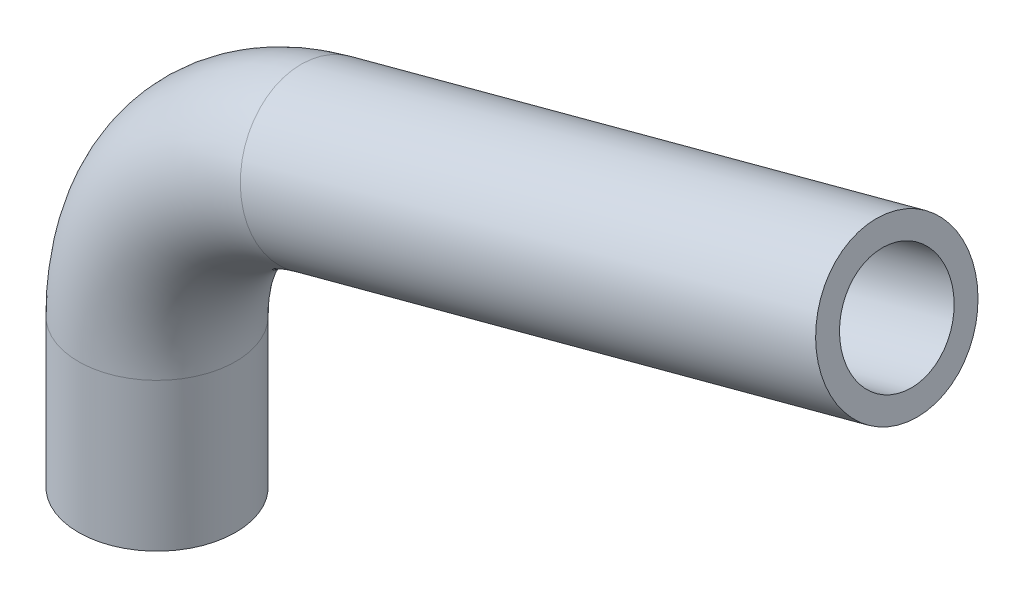
ISO-10303-21;
HEADER;
FILE_DESCRIPTION(('STEP AP214'),'2;1');
FILE_NAME('part.step','',(''),(''),'','','');
FILE_SCHEMA(('AUTOMOTIVE_DESIGN { 1 0 10303 214 1 1 1 1 }'));
ENDSEC;
DATA;
#1=APPLICATION_CONTEXT('core data for automotive mechanical design processes');
#2=APPLICATION_PROTOCOL_DEFINITION('international standard','automotive_design',2000,#1);
#3=PRODUCT_CONTEXT('',#1,'mechanical');
#4=PRODUCT('Part','Part','',(#3));
#5=PRODUCT_RELATED_PRODUCT_CATEGORY('part','',(#4));
#6=PRODUCT_DEFINITION_FORMATION('','',#4);
#7=PRODUCT_DEFINITION_CONTEXT('part definition',#1,'design');
#8=PRODUCT_DEFINITION('design','',#6,#7);
#9=PRODUCT_DEFINITION_SHAPE('','',#8);
#10=(LENGTH_UNIT() NAMED_UNIT(*) SI_UNIT(.MILLI.,.METRE.));
#11=(NAMED_UNIT(*) PLANE_ANGLE_UNIT() SI_UNIT($,.RADIAN.));
#12=(NAMED_UNIT(*) SI_UNIT($,.STERADIAN.) SOLID_ANGLE_UNIT());
#13=UNCERTAINTY_MEASURE_WITH_UNIT(LENGTH_MEASURE(1.E-05),#10,'distance_accuracy_value','');
#14=(GEOMETRIC_REPRESENTATION_CONTEXT(3) GLOBAL_UNCERTAINTY_ASSIGNED_CONTEXT((#13)) GLOBAL_UNIT_ASSIGNED_CONTEXT((#10,
#11,#12)) REPRESENTATION_CONTEXT('',''));
#15=CARTESIAN_POINT('',(0.,0.,0.));
#16=DIRECTION('',(0.,0.,1.));
#17=DIRECTION('',(1.,0.,0.));
#18=AXIS2_PLACEMENT_3D('',#15,#16,#17);
#19=CARTESIAN_POINT('',(0.,0.,0.));
#20=DIRECTION('',(0.,-1.,0.));
#21=DIRECTION('',(1.,0.,0.));
#22=AXIS2_PLACEMENT_3D('',#19,#20,#21);
#23=PLANE('',#22);
#24=CARTESIAN_POINT('',(0.,0.,0.));
#25=DIRECTION('',(0.,-1.,0.));
#26=DIRECTION('',(1.,0.,0.));
#27=AXIS2_PLACEMENT_3D('',#24,#25,#26);
#28=CIRCLE('',#27,9.525);
#29=CARTESIAN_POINT('',(9.52499999999998,0.,0.));
#30=VERTEX_POINT('',#29);
#31=EDGE_CURVE('E80',#30,#30,#28,.T.);
#32=ORIENTED_EDGE('',*,*,#31,.F.);
#33=EDGE_LOOP('',(#32));
#34=FACE_BOUND('',#33,.T.);
#35=CARTESIAN_POINT('',(0.,0.,0.));
#36=DIRECTION('',(0.,-1.,0.));
#37=DIRECTION('',(1.,0.,0.));
#38=AXIS2_PLACEMENT_3D('',#35,#36,#37);
#39=CIRCLE('',#38,13.49375);
#40=CARTESIAN_POINT('',(13.49375,0.,0.));
#41=VERTEX_POINT('',#40);
#42=EDGE_CURVE('E75',#41,#41,#39,.T.);
#43=ORIENTED_EDGE('',*,*,#42,.T.);
#44=EDGE_LOOP('',(#43));
#45=FACE_BOUND('',#44,.T.);
#46=ADVANCED_FACE('F61',(#34,#45),#23,.T.);
#47=CARTESIAN_POINT('',(127.,88.6647056807507,0.));
#48=DIRECTION('',(-0.965925826289069,-0.258819045102518,0.));
#49=DIRECTION('',(0.258819045102518,-0.965925826289069,0.));
#50=AXIS2_PLACEMENT_3D('',#47,#48,#49);
#51=PLANE('',#50);
#52=CARTESIAN_POINT('',(127.,88.6647056807507,0.));
#53=DIRECTION('',(-0.965925826289069,-0.258819045102518,0.));
#54=DIRECTION('',(0.258819045102518,-0.965925826289069,0.));
#55=AXIS2_PLACEMENT_3D('',#52,#53,#54);
#56=CIRCLE('',#55,9.525);
#57=CARTESIAN_POINT('',(129.465251404602,79.4642621853473,0.));
#58=VERTEX_POINT('',#57);
#59=EDGE_CURVE('E83',#58,#58,#56,.T.);
#60=ORIENTED_EDGE('',*,*,#59,.T.);
#61=EDGE_LOOP('',(#60));
#62=FACE_BOUND('',#61,.T.);
#63=CARTESIAN_POINT('',(127.,88.6647056807507,0.));
#64=DIRECTION('',(-0.965925826289069,-0.258819045102518,0.));
#65=DIRECTION('',(0.258819045102518,-0.965925826289069,0.));
#66=AXIS2_PLACEMENT_3D('',#63,#64,#65);
#67=CIRCLE('',#66,13.49375);
#68=CARTESIAN_POINT('',(130.492439489852,75.6307440622626,0.));
#69=VERTEX_POINT('',#68);
#70=EDGE_CURVE('E11',#69,#69,#67,.T.);
#71=ORIENTED_EDGE('',*,*,#70,.F.);
#72=EDGE_LOOP('',(#71));
#73=FACE_BOUND('',#72,.T.);
#74=ADVANCED_FACE('F93',(#62,#73),#51,.F.);
#75=CARTESIAN_POINT('',(0.,0.,0.));
#76=DIRECTION('',(0.,1.,0.));
#77=DIRECTION('',(0.,0.,1.));
#78=AXIS2_PLACEMENT_3D('',#75,#76,#77);
#79=CYLINDRICAL_SURFACE('',#78,13.49375);
#80=CARTESIAN_POINT('',(0.,25.4000000000001,0.));
#81=DIRECTION('',(0.,-1.,0.));
#82=DIRECTION('',(1.,0.,0.));
#83=AXIS2_PLACEMENT_3D('',#80,#81,#82);
#84=CIRCLE('',#83,13.49375);
#85=CARTESIAN_POINT('',(-13.49375,25.4000000000001,0.));
#86=VERTEX_POINT('',#85);
#87=EDGE_CURVE('E71',#86,#86,#84,.T.);
#88=ORIENTED_EDGE('',*,*,#87,.T.);
#89=EDGE_LOOP('',(#88));
#90=FACE_BOUND('',#89,.T.);
#91=ORIENTED_EDGE('',*,*,#42,.F.);
#92=EDGE_LOOP('',(#91));
#93=FACE_BOUND('',#92,.T.);
#94=ADVANCED_FACE('F119',(#90,#93),#79,.T.);
#95=CARTESIAN_POINT('',(38.1,25.4,0.));
#96=DIRECTION('',(0.,0.,-1.));
#97=DIRECTION('',(-1.,0.,0.));
#98=AXIS2_PLACEMENT_3D('',#95,#96,#97);
#99=TOROIDAL_SURFACE('',#98,38.1,13.49375);
#100=CARTESIAN_POINT('',(28.2389943815941,62.2017739816136,0.));
#101=DIRECTION('',(-0.965925826289069,-0.258819045102518,0.));
#102=DIRECTION('',(0.258819045102518,-0.965925826289069,0.));
#103=AXIS2_PLACEMENT_3D('',#100,#101,#102);
#104=CIRCLE('',#103,13.49375);
#105=CARTESIAN_POINT('',(24.746554891742,75.2357356001017,0.));
#106=VERTEX_POINT('',#105);
#107=EDGE_CURVE('E67',#106,#106,#104,.T.);
#108=CARTESIAN_POINT('',(38.1,25.4,0.));
#109=DIRECTION('',(0.,0.,-1.));
#110=DIRECTION('',(-1.,0.,0.));
#111=AXIS2_PLACEMENT_3D('',#108,#109,#110);
#112=CIRCLE('',#111,51.59375);
#113=EDGE_CURVE('',#86,#106,#112,.T.);
#114=ORIENTED_EDGE('',*,*,#87,.F.);
#115=ORIENTED_EDGE('',*,*,#107,.T.);
#116=ORIENTED_EDGE('',*,*,#113,.T.);
#117=ORIENTED_EDGE('',*,*,#113,.F.);
#118=EDGE_LOOP('',(#114,#116,#115,#117));
#119=FACE_BOUND('',#118,.T.);
#120=ADVANCED_FACE('F121',(#119),#99,.T.);
#121=CARTESIAN_POINT('',(28.2389943815941,62.2017739816136,0.));
#122=DIRECTION('',(0.965925826289069,0.258819045102518,0.));
#123=DIRECTION('',(-0.258819045102518,0.965925826289069,0.));
#124=AXIS2_PLACEMENT_3D('',#121,#122,#123);
#125=CYLINDRICAL_SURFACE('',#124,13.49375);
#126=ORIENTED_EDGE('',*,*,#70,.T.);
#127=EDGE_LOOP('',(#126));
#128=FACE_BOUND('',#127,.T.);
#129=ORIENTED_EDGE('',*,*,#107,.F.);
#130=EDGE_LOOP('',(#129));
#131=FACE_BOUND('',#130,.T.);
#132=ADVANCED_FACE('F111',(#128,#131),#125,.T.);
#133=CARTESIAN_POINT('',(0.,-1.,0.));
#134=DIRECTION('',(0.,1.,0.));
#135=DIRECTION('',(0.,0.,1.));
#136=AXIS2_PLACEMENT_3D('',#133,#134,#135);
#137=CYLINDRICAL_SURFACE('',#136,9.525);
#138=CARTESIAN_POINT('',(0.,25.4,0.));
#139=DIRECTION('',(0.,-1.,0.));
#140=DIRECTION('',(1.,0.,0.));
#141=AXIS2_PLACEMENT_3D('',#138,#139,#140);
#142=CIRCLE('',#141,9.525);
#143=CARTESIAN_POINT('',(-9.52500000000003,25.4,0.));
#144=VERTEX_POINT('',#143);
#145=EDGE_CURVE('E84',#144,#144,#142,.T.);
#146=ORIENTED_EDGE('',*,*,#145,.F.);
#147=EDGE_LOOP('',(#146));
#148=FACE_BOUND('',#147,.T.);
#149=ORIENTED_EDGE('',*,*,#31,.T.);
#150=EDGE_LOOP('',(#149));
#151=FACE_BOUND('',#150,.T.);
#152=ADVANCED_FACE('F101',(#148,#151),#137,.F.);
#153=CARTESIAN_POINT('',(38.1,25.4,0.));
#154=DIRECTION('',(0.,0.,-1.));
#155=DIRECTION('',(-1.,0.,0.));
#156=AXIS2_PLACEMENT_3D('',#153,#154,#155);
#157=TOROIDAL_SURFACE('',#156,38.1,9.525);
#158=CARTESIAN_POINT('',(28.238994381594,62.2017739816136,0.));
#159=DIRECTION('',(-0.965925826289069,-0.258819045102518,0.));
#160=DIRECTION('',(0.258819045102518,-0.965925826289069,0.));
#161=AXIS2_PLACEMENT_3D('',#158,#159,#160);
#162=CIRCLE('',#161,9.525);
#163=CARTESIAN_POINT('',(25.7737429769926,71.4022174770169,0.));
#164=VERTEX_POINT('',#163);
#165=EDGE_CURVE('E87',#164,#164,#162,.T.);
#166=CARTESIAN_POINT('',(38.1,25.4,0.));
#167=DIRECTION('',(0.,0.,-1.));
#168=DIRECTION('',(-1.,0.,0.));
#169=AXIS2_PLACEMENT_3D('',#166,#167,#168);
#170=CIRCLE('',#169,47.625);
#171=EDGE_CURVE('',#144,#164,#170,.T.);
#172=ORIENTED_EDGE('',*,*,#145,.T.);
#173=ORIENTED_EDGE('',*,*,#165,.F.);
#174=ORIENTED_EDGE('',*,*,#171,.T.);
#175=ORIENTED_EDGE('',*,*,#171,.F.);
#176=EDGE_LOOP('',(#172,#174,#173,#175));
#177=FACE_BOUND('',#176,.T.);
#178=ADVANCED_FACE('F99',(#177),#157,.F.);
#179=CARTESIAN_POINT('',(28.238994381594,62.2017739816136,0.));
#180=DIRECTION('',(0.965925826289069,0.258819045102518,0.));
#181=DIRECTION('',(-0.258819045102518,0.965925826289069,0.));
#182=AXIS2_PLACEMENT_3D('',#179,#180,#181);
#183=CYLINDRICAL_SURFACE('',#182,9.525);
#184=ORIENTED_EDGE('',*,*,#59,.F.);
#185=EDGE_LOOP('',(#184));
#186=FACE_BOUND('',#185,.T.);
#187=ORIENTED_EDGE('',*,*,#165,.T.);
#188=EDGE_LOOP('',(#187));
#189=FACE_BOUND('',#188,.T.);
#190=ADVANCED_FACE('F96',(#186,#189),#183,.F.);
#191=CLOSED_SHELL('',(#46,#74,#94,#120,#132,#152,#178,#190));
#192=MANIFOLD_SOLID_BREP('B2',#191);
#193=ADVANCED_BREP_SHAPE_REPRESENTATION('',(#18,#192),#14);
#194=SHAPE_DEFINITION_REPRESENTATION(#9,#193);
ENDSEC;
END-ISO-10303-21;
